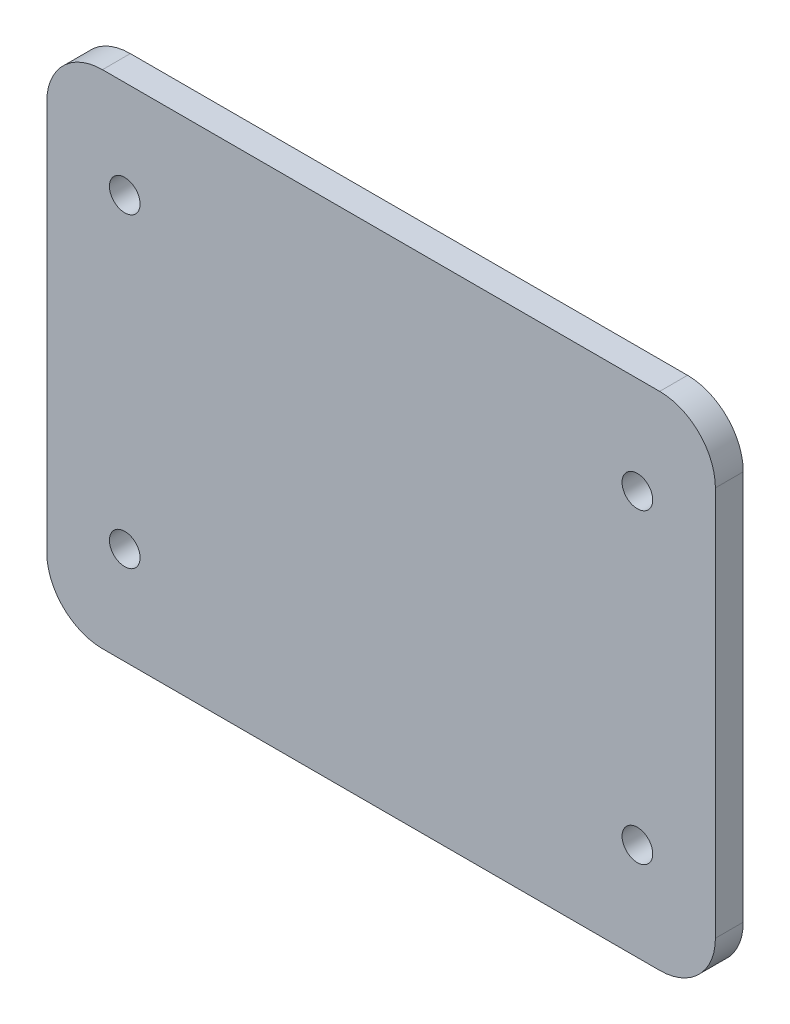
ISO-10303-21;
HEADER;
FILE_DESCRIPTION(('STEP AP214'),'2;1');
FILE_NAME('part.step','',(''),(''),'','','');
FILE_SCHEMA(('AUTOMOTIVE_DESIGN { 1 0 10303 214 1 1 1 1 }'));
ENDSEC;
DATA;
#1=APPLICATION_CONTEXT('core data for automotive mechanical design processes');
#2=APPLICATION_PROTOCOL_DEFINITION('international standard','automotive_design',2000,#1);
#3=PRODUCT_CONTEXT('',#1,'mechanical');
#4=PRODUCT('Part','Part','',(#3));
#5=PRODUCT_RELATED_PRODUCT_CATEGORY('part','',(#4));
#6=PRODUCT_DEFINITION_FORMATION('','',#4);
#7=PRODUCT_DEFINITION_CONTEXT('part definition',#1,'design');
#8=PRODUCT_DEFINITION('design','',#6,#7);
#9=PRODUCT_DEFINITION_SHAPE('','',#8);
#10=(LENGTH_UNIT() NAMED_UNIT(*) SI_UNIT(.MILLI.,.METRE.));
#11=(NAMED_UNIT(*) PLANE_ANGLE_UNIT() SI_UNIT($,.RADIAN.));
#12=(NAMED_UNIT(*) SI_UNIT($,.STERADIAN.) SOLID_ANGLE_UNIT());
#13=UNCERTAINTY_MEASURE_WITH_UNIT(LENGTH_MEASURE(1.E-05),#10,'distance_accuracy_value','');
#14=(GEOMETRIC_REPRESENTATION_CONTEXT(3) GLOBAL_UNCERTAINTY_ASSIGNED_CONTEXT((#13)) GLOBAL_UNIT_ASSIGNED_CONTEXT((#10,
#11,#12)) REPRESENTATION_CONTEXT('',''));
#15=CARTESIAN_POINT('',(0.,0.,0.));
#16=DIRECTION('',(0.,0.,1.));
#17=DIRECTION('',(1.,0.,0.));
#18=AXIS2_PLACEMENT_3D('',#15,#16,#17);
#19=CARTESIAN_POINT('',(0.,-61.7872340425532,5.));
#20=DIRECTION('',(0.,1.,0.));
#21=DIRECTION('',(0.,0.,1.));
#22=AXIS2_PLACEMENT_3D('',#19,#20,#21);
#23=PLANE('',#22);
#24=DIRECTION('',(1.,0.,0.));
#25=VECTOR('',#24,1.);
#26=CARTESIAN_POINT('',(0.,-61.7872340425532,5.));
#27=LINE('',#26,#25);
#28=CARTESIAN_POINT('',(-30.8510638297872,-61.7872340425532,5.));
#29=VERTEX_POINT('',#28);
#30=CARTESIAN_POINT('',(69.1489361702128,-61.7872340425532,5.));
#31=VERTEX_POINT('',#30);
#32=EDGE_CURVE('E156',#29,#31,#27,.T.);
#33=ORIENTED_EDGE('',*,*,#32,.F.);
#34=DIRECTION('',(0.,0.,-1.));
#35=VECTOR('',#34,1.);
#36=CARTESIAN_POINT('',(-30.8510638297872,-61.7872340425532,5.));
#37=LINE('',#36,#35);
#38=CARTESIAN_POINT('',(-30.8510638297872,-61.7872340425532,0.));
#39=VERTEX_POINT('',#38);
#40=EDGE_CURVE('E11',#29,#39,#37,.T.);
#41=ORIENTED_EDGE('',*,*,#40,.T.);
#42=DIRECTION('',(1.,0.,0.));
#43=VECTOR('',#42,1.);
#44=CARTESIAN_POINT('',(0.,-61.7872340425532,0.));
#45=LINE('',#44,#43);
#46=CARTESIAN_POINT('',(69.1489361702128,-61.7872340425532,0.));
#47=VERTEX_POINT('',#46);
#48=EDGE_CURVE('E159',#39,#47,#45,.T.);
#49=ORIENTED_EDGE('',*,*,#48,.T.);
#50=DIRECTION('',(0.,0.,-1.));
#51=VECTOR('',#50,1.);
#52=CARTESIAN_POINT('',(69.1489361702128,-61.7872340425532,5.));
#53=LINE('',#52,#51);
#54=EDGE_CURVE('E41',#47,#31,#53,.F.);
#55=ORIENTED_EDGE('',*,*,#54,.T.);
#56=EDGE_LOOP('',(#33,#41,#49,#55));
#57=FACE_BOUND('',#56,.T.);
#58=ADVANCED_FACE('F33',(#57),#23,.F.);
#59=CARTESIAN_POINT('',(79.1489361702127,0.,5.));
#60=DIRECTION('',(1.,0.,0.));
#61=DIRECTION('',(0.,1.,0.));
#62=AXIS2_PLACEMENT_3D('',#59,#60,#61);
#63=PLANE('',#62);
#64=DIRECTION('',(0.,-1.,0.));
#65=VECTOR('',#64,1.);
#66=CARTESIAN_POINT('',(79.1489361702127,0.,0.));
#67=LINE('',#66,#65);
#68=CARTESIAN_POINT('',(79.1489361702127,18.2127659574468,0.));
#69=VERTEX_POINT('',#68);
#70=CARTESIAN_POINT('',(79.1489361702128,-51.7872340425532,0.));
#71=VERTEX_POINT('',#70);
#72=EDGE_CURVE('E120',#69,#71,#67,.T.);
#73=ORIENTED_EDGE('',*,*,#72,.F.);
#74=DIRECTION('',(0.,0.,-1.));
#75=VECTOR('',#74,1.);
#76=CARTESIAN_POINT('',(79.1489361702127,18.2127659574468,5.));
#77=LINE('',#76,#75);
#78=CARTESIAN_POINT('',(79.1489361702127,18.2127659574468,5.));
#79=VERTEX_POINT('',#78);
#80=EDGE_CURVE('E140',#69,#79,#77,.F.);
#81=ORIENTED_EDGE('',*,*,#80,.T.);
#82=DIRECTION('',(0.,-1.,0.));
#83=VECTOR('',#82,1.);
#84=CARTESIAN_POINT('',(79.1489361702127,0.,5.));
#85=LINE('',#84,#83);
#86=CARTESIAN_POINT('',(79.1489361702128,-51.7872340425532,5.));
#87=VERTEX_POINT('',#86);
#88=EDGE_CURVE('E167',#79,#87,#85,.T.);
#89=ORIENTED_EDGE('',*,*,#88,.T.);
#90=DIRECTION('',(0.,0.,-1.));
#91=VECTOR('',#90,1.);
#92=CARTESIAN_POINT('',(79.1489361702128,-51.7872340425532,0.));
#93=LINE('',#92,#91);
#94=EDGE_CURVE('E137',#87,#71,#93,.T.);
#95=ORIENTED_EDGE('',*,*,#94,.T.);
#96=EDGE_LOOP('',(#73,#81,#89,#95));
#97=FACE_BOUND('',#96,.T.);
#98=ADVANCED_FACE('F173',(#97),#63,.T.);
#99=CARTESIAN_POINT('',(0.,28.2127659574468,5.));
#100=DIRECTION('',(0.,1.,0.));
#101=DIRECTION('',(0.,0.,1.));
#102=AXIS2_PLACEMENT_3D('',#99,#100,#101);
#103=PLANE('',#102);
#104=DIRECTION('',(1.,0.,0.));
#105=VECTOR('',#104,1.);
#106=CARTESIAN_POINT('',(0.,28.2127659574468,5.));
#107=LINE('',#106,#105);
#108=CARTESIAN_POINT('',(-30.8510638297873,28.2127659574468,5.));
#109=VERTEX_POINT('',#108);
#110=CARTESIAN_POINT('',(69.1489361702127,28.2127659574468,5.));
#111=VERTEX_POINT('',#110);
#112=EDGE_CURVE('E227',#109,#111,#107,.T.);
#113=ORIENTED_EDGE('',*,*,#112,.T.);
#114=DIRECTION('',(0.,0.,-1.));
#115=VECTOR('',#114,1.);
#116=CARTESIAN_POINT('',(69.1489361702127,28.2127659574468,5.));
#117=LINE('',#116,#115);
#118=CARTESIAN_POINT('',(69.1489361702127,28.2127659574468,0.));
#119=VERTEX_POINT('',#118);
#120=EDGE_CURVE('E119',#111,#119,#117,.T.);
#121=ORIENTED_EDGE('',*,*,#120,.T.);
#122=DIRECTION('',(1.,0.,0.));
#123=VECTOR('',#122,1.);
#124=CARTESIAN_POINT('',(0.,28.2127659574468,0.));
#125=LINE('',#124,#123);
#126=CARTESIAN_POINT('',(-30.8510638297873,28.2127659574468,0.));
#127=VERTEX_POINT('',#126);
#128=EDGE_CURVE('E104',#127,#119,#125,.T.);
#129=ORIENTED_EDGE('',*,*,#128,.F.);
#130=DIRECTION('',(0.,0.,-1.));
#131=VECTOR('',#130,1.);
#132=CARTESIAN_POINT('',(-30.8510638297873,28.2127659574468,5.));
#133=LINE('',#132,#131);
#134=EDGE_CURVE('E117',#127,#109,#133,.F.);
#135=ORIENTED_EDGE('',*,*,#134,.T.);
#136=EDGE_LOOP('',(#113,#121,#129,#135));
#137=FACE_BOUND('',#136,.T.);
#138=ADVANCED_FACE('F116',(#137),#103,.T.);
#139=CARTESIAN_POINT('',(65.1489361702128,-44.2872340425532,5.));
#140=DIRECTION('',(0.,0.,-1.));
#141=DIRECTION('',(-1.,0.,0.));
#142=AXIS2_PLACEMENT_3D('',#139,#140,#141);
#143=CYLINDRICAL_SURFACE('',#142,2.75000000000001);
#144=CARTESIAN_POINT('',(65.1489361702128,-44.2872340425532,5.));
#145=DIRECTION('',(0.,0.,1.));
#146=DIRECTION('',(1.,0.,0.));
#147=AXIS2_PLACEMENT_3D('',#144,#145,#146);
#148=CIRCLE('',#147,2.75000000000001);
#149=CARTESIAN_POINT('',(67.8989361702128,-44.2872340425532,5.));
#150=VERTEX_POINT('',#149);
#151=EDGE_CURVE('E128',#150,#150,#148,.T.);
#152=ORIENTED_EDGE('',*,*,#151,.T.);
#153=EDGE_LOOP('',(#152));
#154=FACE_BOUND('',#153,.T.);
#155=CARTESIAN_POINT('',(65.1489361702128,-44.2872340425532,0.));
#156=DIRECTION('',(0.,0.,1.));
#157=DIRECTION('',(1.,0.,0.));
#158=AXIS2_PLACEMENT_3D('',#155,#156,#157);
#159=CIRCLE('',#158,2.75000000000001);
#160=CARTESIAN_POINT('',(67.8989361702128,-44.2872340425532,0.));
#161=VERTEX_POINT('',#160);
#162=EDGE_CURVE('E184',#161,#161,#159,.T.);
#163=ORIENTED_EDGE('',*,*,#162,.F.);
#164=EDGE_LOOP('',(#163));
#165=FACE_BOUND('',#164,.T.);
#166=ADVANCED_FACE('F240',(#154,#165),#143,.F.);
#167=CARTESIAN_POINT('',(-26.8510638297873,10.7127659574468,5.));
#168=DIRECTION('',(0.,0.,-1.));
#169=DIRECTION('',(-1.,0.,0.));
#170=AXIS2_PLACEMENT_3D('',#167,#168,#169);
#171=CYLINDRICAL_SURFACE('',#170,2.75000000000001);
#172=CARTESIAN_POINT('',(-26.8510638297873,10.7127659574468,5.));
#173=DIRECTION('',(0.,0.,1.));
#174=DIRECTION('',(1.,0.,0.));
#175=AXIS2_PLACEMENT_3D('',#172,#173,#174);
#176=CIRCLE('',#175,2.75000000000001);
#177=CARTESIAN_POINT('',(-24.1010638297873,10.7127659574468,5.));
#178=VERTEX_POINT('',#177);
#179=EDGE_CURVE('E230',#178,#178,#176,.F.);
#180=ORIENTED_EDGE('',*,*,#179,.F.);
#181=EDGE_LOOP('',(#180));
#182=FACE_BOUND('',#181,.T.);
#183=CARTESIAN_POINT('',(-26.8510638297873,10.7127659574468,0.));
#184=DIRECTION('',(0.,0.,1.));
#185=DIRECTION('',(1.,0.,0.));
#186=AXIS2_PLACEMENT_3D('',#183,#184,#185);
#187=CIRCLE('',#186,2.75000000000001);
#188=CARTESIAN_POINT('',(-24.1010638297873,10.7127659574468,0.));
#189=VERTEX_POINT('',#188);
#190=EDGE_CURVE('E182',#189,#189,#187,.F.);
#191=ORIENTED_EDGE('',*,*,#190,.T.);
#192=EDGE_LOOP('',(#191));
#193=FACE_BOUND('',#192,.T.);
#194=ADVANCED_FACE('F246',(#182,#193),#171,.F.);
#195=CARTESIAN_POINT('',(-26.8510638297873,-44.2872340425531,5.));
#196=DIRECTION('',(0.,0.,-1.));
#197=DIRECTION('',(-1.,0.,0.));
#198=AXIS2_PLACEMENT_3D('',#195,#196,#197);
#199=CYLINDRICAL_SURFACE('',#198,2.75000000000001);
#200=CARTESIAN_POINT('',(-26.8510638297873,-44.2872340425531,5.));
#201=DIRECTION('',(0.,0.,1.));
#202=DIRECTION('',(1.,0.,0.));
#203=AXIS2_PLACEMENT_3D('',#200,#201,#202);
#204=CIRCLE('',#203,2.75000000000001);
#205=CARTESIAN_POINT('',(-24.1010638297873,-44.2872340425531,5.));
#206=VERTEX_POINT('',#205);
#207=EDGE_CURVE('E226',#206,#206,#204,.F.);
#208=ORIENTED_EDGE('',*,*,#207,.F.);
#209=EDGE_LOOP('',(#208));
#210=FACE_BOUND('',#209,.T.);
#211=CARTESIAN_POINT('',(-26.8510638297873,-44.2872340425531,0.));
#212=DIRECTION('',(0.,0.,1.));
#213=DIRECTION('',(1.,0.,0.));
#214=AXIS2_PLACEMENT_3D('',#211,#212,#213);
#215=CIRCLE('',#214,2.75000000000001);
#216=CARTESIAN_POINT('',(-24.1010638297873,-44.2872340425531,0.));
#217=VERTEX_POINT('',#216);
#218=EDGE_CURVE('E179',#217,#217,#215,.F.);
#219=ORIENTED_EDGE('',*,*,#218,.T.);
#220=EDGE_LOOP('',(#219));
#221=FACE_BOUND('',#220,.T.);
#222=ADVANCED_FACE('F202',(#210,#221),#199,.F.);
#223=CARTESIAN_POINT('',(-40.8510638297873,0.,5.));
#224=DIRECTION('',(1.,0.,0.));
#225=DIRECTION('',(0.,1.,0.));
#226=AXIS2_PLACEMENT_3D('',#223,#224,#225);
#227=PLANE('',#226);
#228=DIRECTION('',(0.,-1.,0.));
#229=VECTOR('',#228,1.);
#230=CARTESIAN_POINT('',(-40.8510638297873,0.,5.));
#231=LINE('',#230,#229);
#232=CARTESIAN_POINT('',(-40.8510638297873,18.2127659574468,5.));
#233=VERTEX_POINT('',#232);
#234=CARTESIAN_POINT('',(-40.8510638297872,-51.7872340425532,5.));
#235=VERTEX_POINT('',#234);
#236=EDGE_CURVE('E225',#233,#235,#231,.T.);
#237=ORIENTED_EDGE('',*,*,#236,.F.);
#238=DIRECTION('',(0.,0.,-1.));
#239=VECTOR('',#238,1.);
#240=CARTESIAN_POINT('',(-40.8510638297873,18.2127659574468,0.));
#241=LINE('',#240,#239);
#242=CARTESIAN_POINT('',(-40.8510638297873,18.2127659574468,0.));
#243=VERTEX_POINT('',#242);
#244=EDGE_CURVE('E150',#233,#243,#241,.T.);
#245=ORIENTED_EDGE('',*,*,#244,.T.);
#246=DIRECTION('',(0.,-1.,0.));
#247=VECTOR('',#246,1.);
#248=CARTESIAN_POINT('',(-40.8510638297873,0.,0.));
#249=LINE('',#248,#247);
#250=CARTESIAN_POINT('',(-40.8510638297872,-51.7872340425532,0.));
#251=VERTEX_POINT('',#250);
#252=EDGE_CURVE('E105',#243,#251,#249,.T.);
#253=ORIENTED_EDGE('',*,*,#252,.T.);
#254=DIRECTION('',(0.,0.,-1.));
#255=VECTOR('',#254,1.);
#256=CARTESIAN_POINT('',(-40.8510638297872,-51.7872340425532,5.));
#257=LINE('',#256,#255);
#258=EDGE_CURVE('E48',#251,#235,#257,.F.);
#259=ORIENTED_EDGE('',*,*,#258,.T.);
#260=EDGE_LOOP('',(#237,#245,#253,#259));
#261=FACE_BOUND('',#260,.T.);
#262=ADVANCED_FACE('F194',(#261),#227,.F.);
#263=CARTESIAN_POINT('',(65.1489361702128,10.7127659574468,5.));
#264=DIRECTION('',(0.,0.,-1.));
#265=DIRECTION('',(-1.,0.,0.));
#266=AXIS2_PLACEMENT_3D('',#263,#264,#265);
#267=CYLINDRICAL_SURFACE('',#266,2.75000000000001);
#268=CARTESIAN_POINT('',(65.1489361702128,10.7127659574468,5.));
#269=DIRECTION('',(0.,0.,1.));
#270=DIRECTION('',(1.,0.,0.));
#271=AXIS2_PLACEMENT_3D('',#268,#269,#270);
#272=CIRCLE('',#271,2.75000000000001);
#273=CARTESIAN_POINT('',(67.8989361702128,10.7127659574468,5.));
#274=VERTEX_POINT('',#273);
#275=EDGE_CURVE('E123',#274,#274,#272,.T.);
#276=ORIENTED_EDGE('',*,*,#275,.T.);
#277=EDGE_LOOP('',(#276));
#278=FACE_BOUND('',#277,.T.);
#279=CARTESIAN_POINT('',(65.1489361702128,10.7127659574468,0.));
#280=DIRECTION('',(0.,0.,1.));
#281=DIRECTION('',(1.,0.,0.));
#282=AXIS2_PLACEMENT_3D('',#279,#280,#281);
#283=CIRCLE('',#282,2.75000000000001);
#284=CARTESIAN_POINT('',(67.8989361702128,10.7127659574468,0.));
#285=VERTEX_POINT('',#284);
#286=EDGE_CURVE('E131',#285,#285,#283,.T.);
#287=ORIENTED_EDGE('',*,*,#286,.F.);
#288=EDGE_LOOP('',(#287));
#289=FACE_BOUND('',#288,.T.);
#290=ADVANCED_FACE('F192',(#278,#289),#267,.F.);
#291=CARTESIAN_POINT('',(0.,0.,5.));
#292=DIRECTION('',(0.,0.,1.));
#293=DIRECTION('',(1.,0.,0.));
#294=AXIS2_PLACEMENT_3D('',#291,#292,#293);
#295=PLANE('',#294);
#296=ORIENTED_EDGE('',*,*,#88,.F.);
#297=CARTESIAN_POINT('',(69.1489361702127,18.2127659574468,5.));
#298=DIRECTION('',(0.,0.,1.));
#299=DIRECTION('',(1.,0.,0.));
#300=AXIS2_PLACEMENT_3D('',#297,#298,#299);
#301=CIRCLE('',#300,10.);
#302=EDGE_CURVE('E147',#79,#111,#301,.T.);
#303=ORIENTED_EDGE('',*,*,#302,.T.);
#304=ORIENTED_EDGE('',*,*,#112,.F.);
#305=CARTESIAN_POINT('',(-30.8510638297873,18.2127659574468,5.));
#306=DIRECTION('',(0.,0.,1.));
#307=DIRECTION('',(1.,0.,0.));
#308=AXIS2_PLACEMENT_3D('',#305,#306,#307);
#309=CIRCLE('',#308,10.);
#310=EDGE_CURVE('E55',#109,#233,#309,.T.);
#311=ORIENTED_EDGE('',*,*,#310,.T.);
#312=ORIENTED_EDGE('',*,*,#236,.T.);
#313=CARTESIAN_POINT('',(-30.8510638297872,-51.7872340425532,5.));
#314=DIRECTION('',(0.,0.,1.));
#315=DIRECTION('',(1.,0.,0.));
#316=AXIS2_PLACEMENT_3D('',#313,#314,#315);
#317=CIRCLE('',#316,10.);
#318=EDGE_CURVE('E144',#235,#29,#317,.T.);
#319=ORIENTED_EDGE('',*,*,#318,.T.);
#320=ORIENTED_EDGE('',*,*,#32,.T.);
#321=CARTESIAN_POINT('',(69.1489361702128,-51.7872340425532,5.));
#322=DIRECTION('',(0.,0.,1.));
#323=DIRECTION('',(1.,0.,0.));
#324=AXIS2_PLACEMENT_3D('',#321,#322,#323);
#325=CIRCLE('',#324,10.);
#326=EDGE_CURVE('E142',#31,#87,#325,.T.);
#327=ORIENTED_EDGE('',*,*,#326,.T.);
#328=EDGE_LOOP('',(#296,#303,#304,#311,#312,#319,#320,#327));
#329=FACE_BOUND('',#328,.T.);
#330=ORIENTED_EDGE('',*,*,#207,.T.);
#331=EDGE_LOOP('',(#330));
#332=FACE_BOUND('',#331,.T.);
#333=ORIENTED_EDGE('',*,*,#179,.T.);
#334=EDGE_LOOP('',(#333));
#335=FACE_BOUND('',#334,.T.);
#336=ORIENTED_EDGE('',*,*,#151,.F.);
#337=EDGE_LOOP('',(#336));
#338=FACE_BOUND('',#337,.T.);
#339=ORIENTED_EDGE('',*,*,#275,.F.);
#340=EDGE_LOOP('',(#339));
#341=FACE_BOUND('',#340,.T.);
#342=ADVANCED_FACE('F163',(#329,#332,#335,#338,#341),#295,.T.);
#343=CARTESIAN_POINT('',(0.,0.,0.));
#344=DIRECTION('',(0.,0.,1.));
#345=DIRECTION('',(1.,0.,0.));
#346=AXIS2_PLACEMENT_3D('',#343,#344,#345);
#347=PLANE('',#346);
#348=ORIENTED_EDGE('',*,*,#128,.T.);
#349=CARTESIAN_POINT('',(69.1489361702127,18.2127659574468,0.));
#350=DIRECTION('',(0.,0.,1.));
#351=DIRECTION('',(1.,0.,0.));
#352=AXIS2_PLACEMENT_3D('',#349,#350,#351);
#353=CIRCLE('',#352,10.);
#354=EDGE_CURVE('E110',#119,#69,#353,.F.);
#355=ORIENTED_EDGE('',*,*,#354,.T.);
#356=ORIENTED_EDGE('',*,*,#72,.T.);
#357=CARTESIAN_POINT('',(69.1489361702128,-51.7872340425532,0.));
#358=DIRECTION('',(0.,0.,1.));
#359=DIRECTION('',(1.,0.,0.));
#360=AXIS2_PLACEMENT_3D('',#357,#358,#359);
#361=CIRCLE('',#360,10.);
#362=EDGE_CURVE('E125',#71,#47,#361,.F.);
#363=ORIENTED_EDGE('',*,*,#362,.T.);
#364=ORIENTED_EDGE('',*,*,#48,.F.);
#365=CARTESIAN_POINT('',(-30.8510638297872,-51.7872340425532,0.));
#366=DIRECTION('',(0.,0.,1.));
#367=DIRECTION('',(1.,0.,0.));
#368=AXIS2_PLACEMENT_3D('',#365,#366,#367);
#369=CIRCLE('',#368,10.);
#370=EDGE_CURVE('E111',#39,#251,#369,.F.);
#371=ORIENTED_EDGE('',*,*,#370,.T.);
#372=ORIENTED_EDGE('',*,*,#252,.F.);
#373=CARTESIAN_POINT('',(-30.8510638297873,18.2127659574468,0.));
#374=DIRECTION('',(0.,0.,1.));
#375=DIRECTION('',(1.,0.,0.));
#376=AXIS2_PLACEMENT_3D('',#373,#374,#375);
#377=CIRCLE('',#376,10.);
#378=EDGE_CURVE('E100',#243,#127,#377,.F.);
#379=ORIENTED_EDGE('',*,*,#378,.T.);
#380=EDGE_LOOP('',(#348,#355,#356,#363,#364,#371,#372,#379));
#381=FACE_BOUND('',#380,.T.);
#382=ORIENTED_EDGE('',*,*,#218,.F.);
#383=EDGE_LOOP('',(#382));
#384=FACE_BOUND('',#383,.T.);
#385=ORIENTED_EDGE('',*,*,#190,.F.);
#386=EDGE_LOOP('',(#385));
#387=FACE_BOUND('',#386,.T.);
#388=ORIENTED_EDGE('',*,*,#162,.T.);
#389=EDGE_LOOP('',(#388));
#390=FACE_BOUND('',#389,.T.);
#391=ORIENTED_EDGE('',*,*,#286,.T.);
#392=EDGE_LOOP('',(#391));
#393=FACE_BOUND('',#392,.T.);
#394=ADVANCED_FACE('F102',(#381,#384,#387,#390,#393),#347,.F.);
#395=CARTESIAN_POINT('',(69.1489361702127,18.2127659574468,5.));
#396=DIRECTION('',(0.,0.,-1.));
#397=DIRECTION('',(-1.,0.,0.));
#398=AXIS2_PLACEMENT_3D('',#395,#396,#397);
#399=CYLINDRICAL_SURFACE('',#398,10.);
#400=ORIENTED_EDGE('',*,*,#302,.F.);
#401=ORIENTED_EDGE('',*,*,#80,.F.);
#402=ORIENTED_EDGE('',*,*,#354,.F.);
#403=ORIENTED_EDGE('',*,*,#120,.F.);
#404=EDGE_LOOP('',(#400,#401,#402,#403));
#405=FACE_BOUND('',#404,.T.);
#406=ADVANCED_FACE('F214',(#405),#399,.T.);
#407=CARTESIAN_POINT('',(-30.8510638297873,18.2127659574468,5.));
#408=DIRECTION('',(0.,0.,1.));
#409=DIRECTION('',(1.,0.,0.));
#410=AXIS2_PLACEMENT_3D('',#407,#408,#409);
#411=CYLINDRICAL_SURFACE('',#410,10.);
#412=ORIENTED_EDGE('',*,*,#310,.F.);
#413=ORIENTED_EDGE('',*,*,#134,.F.);
#414=ORIENTED_EDGE('',*,*,#378,.F.);
#415=ORIENTED_EDGE('',*,*,#244,.F.);
#416=EDGE_LOOP('',(#412,#413,#414,#415));
#417=FACE_BOUND('',#416,.T.);
#418=ADVANCED_FACE('F122',(#417),#411,.T.);
#419=CARTESIAN_POINT('',(-30.8510638297872,-51.7872340425532,5.));
#420=DIRECTION('',(0.,0.,-1.));
#421=DIRECTION('',(-1.,0.,0.));
#422=AXIS2_PLACEMENT_3D('',#419,#420,#421);
#423=CYLINDRICAL_SURFACE('',#422,10.);
#424=ORIENTED_EDGE('',*,*,#318,.F.);
#425=ORIENTED_EDGE('',*,*,#258,.F.);
#426=ORIENTED_EDGE('',*,*,#370,.F.);
#427=ORIENTED_EDGE('',*,*,#40,.F.);
#428=EDGE_LOOP('',(#424,#425,#426,#427));
#429=FACE_BOUND('',#428,.T.);
#430=ADVANCED_FACE('F219',(#429),#423,.T.);
#431=CARTESIAN_POINT('',(69.1489361702128,-51.7872340425532,5.));
#432=DIRECTION('',(0.,0.,1.));
#433=DIRECTION('',(1.,0.,0.));
#434=AXIS2_PLACEMENT_3D('',#431,#432,#433);
#435=CYLINDRICAL_SURFACE('',#434,10.);
#436=ORIENTED_EDGE('',*,*,#326,.F.);
#437=ORIENTED_EDGE('',*,*,#54,.F.);
#438=ORIENTED_EDGE('',*,*,#362,.F.);
#439=ORIENTED_EDGE('',*,*,#94,.F.);
#440=EDGE_LOOP('',(#436,#437,#438,#439));
#441=FACE_BOUND('',#440,.T.);
#442=ADVANCED_FACE('F35',(#441),#435,.T.);
#443=CLOSED_SHELL('',(#58,#98,#138,#166,#194,#222,#262,#290,#342,#394,#406,#418,#430,#442));
#444=MANIFOLD_SOLID_BREP('B2',#443);
#445=ADVANCED_BREP_SHAPE_REPRESENTATION('',(#18,#444),#14);
#446=SHAPE_DEFINITION_REPRESENTATION(#9,#445);
ENDSEC;
END-ISO-10303-21;
